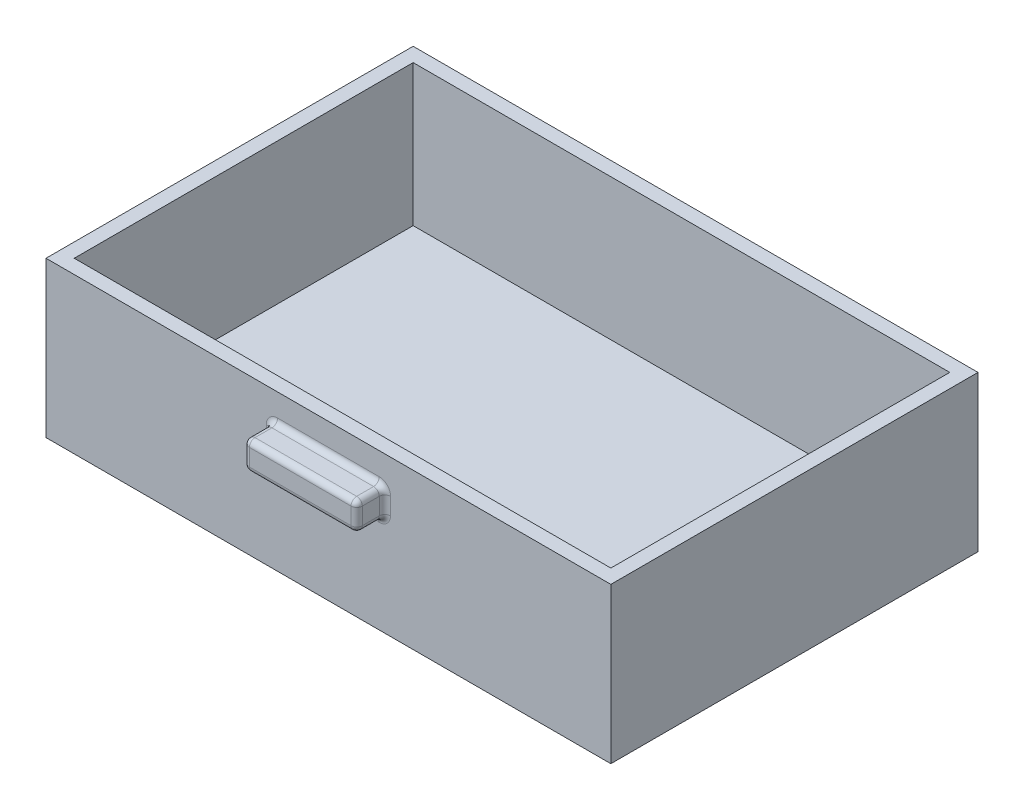
ISO-10303-21;
HEADER;
FILE_DESCRIPTION(('STEP AP214'),'2;1');
FILE_NAME('part.step','',(''),(''),'','','');
FILE_SCHEMA(('AUTOMOTIVE_DESIGN { 1 0 10303 214 1 1 1 1 }'));
ENDSEC;
DATA;
#1=APPLICATION_CONTEXT('core data for automotive mechanical design processes');
#2=APPLICATION_PROTOCOL_DEFINITION('international standard','automotive_design',2000,#1);
#3=PRODUCT_CONTEXT('',#1,'mechanical');
#4=PRODUCT('Part','Part','',(#3));
#5=PRODUCT_RELATED_PRODUCT_CATEGORY('part','',(#4));
#6=PRODUCT_DEFINITION_FORMATION('','',#4);
#7=PRODUCT_DEFINITION_CONTEXT('part definition',#1,'design');
#8=PRODUCT_DEFINITION('design','',#6,#7);
#9=PRODUCT_DEFINITION_SHAPE('','',#8);
#10=(LENGTH_UNIT() NAMED_UNIT(*) SI_UNIT(.MILLI.,.METRE.));
#11=(NAMED_UNIT(*) PLANE_ANGLE_UNIT() SI_UNIT($,.RADIAN.));
#12=(NAMED_UNIT(*) SI_UNIT($,.STERADIAN.) SOLID_ANGLE_UNIT());
#13=UNCERTAINTY_MEASURE_WITH_UNIT(LENGTH_MEASURE(1.E-05),#10,'distance_accuracy_value','');
#14=(GEOMETRIC_REPRESENTATION_CONTEXT(3) GLOBAL_UNCERTAINTY_ASSIGNED_CONTEXT((#13)) GLOBAL_UNIT_ASSIGNED_CONTEXT((#10,
#11,#12)) REPRESENTATION_CONTEXT('',''));
#15=CARTESIAN_POINT('',(0.,0.,0.));
#16=DIRECTION('',(0.,0.,1.));
#17=DIRECTION('',(1.,0.,0.));
#18=AXIS2_PLACEMENT_3D('',#15,#16,#17);
#19=CARTESIAN_POINT('',(-127.,6.35,82.55));
#20=DIRECTION('',(0.,0.,-1.));
#21=DIRECTION('',(-1.,0.,0.));
#22=AXIS2_PLACEMENT_3D('',#19,#20,#21);
#23=PLANE('',#22);
#24=DIRECTION('',(1.,0.,0.));
#25=VECTOR('',#24,1.);
#26=CARTESIAN_POINT('',(-127.,0.,82.55));
#27=LINE('',#26,#25);
#28=CARTESIAN_POINT('',(-127.,0.,82.55));
#29=VERTEX_POINT('',#28);
#30=CARTESIAN_POINT('',(127.,0.,82.55));
#31=VERTEX_POINT('',#30);
#32=EDGE_CURVE('E346',#29,#31,#27,.T.);
#33=ORIENTED_EDGE('',*,*,#32,.T.);
#34=DIRECTION('',(0.,-1.,0.));
#35=VECTOR('',#34,1.);
#36=CARTESIAN_POINT('',(127.,6.35,82.55));
#37=LINE('',#36,#35);
#38=CARTESIAN_POINT('',(127.,69.85,82.55));
#39=VERTEX_POINT('',#38);
#40=EDGE_CURVE('E349',#39,#31,#37,.T.);
#41=ORIENTED_EDGE('',*,*,#40,.F.);
#42=DIRECTION('',(1.,0.,0.));
#43=VECTOR('',#42,1.);
#44=CARTESIAN_POINT('',(-127.,69.85,82.55));
#45=LINE('',#44,#43);
#46=CARTESIAN_POINT('',(-127.,69.85,82.55));
#47=VERTEX_POINT('',#46);
#48=EDGE_CURVE('E324',#47,#39,#45,.T.);
#49=ORIENTED_EDGE('',*,*,#48,.F.);
#50=DIRECTION('',(0.,-1.,0.));
#51=VECTOR('',#50,1.);
#52=CARTESIAN_POINT('',(-127.,6.35,82.55));
#53=LINE('',#52,#51);
#54=EDGE_CURVE('E353',#47,#29,#53,.T.);
#55=ORIENTED_EDGE('',*,*,#54,.T.);
#56=EDGE_LOOP('',(#33,#41,#49,#55));
#57=FACE_BOUND('',#56,.T.);
#58=DIRECTION('',(1.,0.,0.));
#59=VECTOR('',#58,1.);
#60=CARTESIAN_POINT('',(22.225,41.91,82.55));
#61=LINE('',#60,#59);
#62=CARTESIAN_POINT('',(22.86,41.91,82.55));
#63=VERTEX_POINT('',#62);
#64=CARTESIAN_POINT('',(22.225,41.91,82.55));
#65=VERTEX_POINT('',#64);
#66=EDGE_CURVE('E409',#63,#65,#61,.F.);
#67=ORIENTED_EDGE('',*,*,#66,.T.);
#68=DIRECTION('',(0.,-1.,0.));
#69=VECTOR('',#68,1.);
#70=CARTESIAN_POINT('',(22.225,53.34,82.55));
#71=LINE('',#70,#69);
#72=CARTESIAN_POINT('',(22.225,53.34,82.55));
#73=VERTEX_POINT('',#72);
#74=EDGE_CURVE('E238',#73,#65,#71,.T.);
#75=ORIENTED_EDGE('',*,*,#74,.F.);
#76=DIRECTION('',(1.,0.,0.));
#77=VECTOR('',#76,1.);
#78=CARTESIAN_POINT('',(-22.225,53.34,82.55));
#79=LINE('',#78,#77);
#80=CARTESIAN_POINT('',(-22.225,53.34,82.55));
#81=VERTEX_POINT('',#80);
#82=EDGE_CURVE('E242',#81,#73,#79,.T.);
#83=ORIENTED_EDGE('',*,*,#82,.F.);
#84=DIRECTION('',(0.,-1.,0.));
#85=VECTOR('',#84,1.);
#86=CARTESIAN_POINT('',(-22.225,53.34,82.55));
#87=LINE('',#86,#85);
#88=CARTESIAN_POINT('',(-22.225,41.91,82.55));
#89=VERTEX_POINT('',#88);
#90=EDGE_CURVE('E227',#81,#89,#87,.T.);
#91=ORIENTED_EDGE('',*,*,#90,.T.);
#92=DIRECTION('',(1.,0.,0.));
#93=VECTOR('',#92,1.);
#94=CARTESIAN_POINT('',(-25.4,41.91,82.55));
#95=LINE('',#94,#93);
#96=CARTESIAN_POINT('',(-22.86,41.91,82.55));
#97=VERTEX_POINT('',#96);
#98=EDGE_CURVE('E402',#89,#97,#95,.F.);
#99=ORIENTED_EDGE('',*,*,#98,.T.);
#100=CARTESIAN_POINT('',(-22.86,46.99,82.55));
#101=DIRECTION('',(0.,0.,-1.));
#102=DIRECTION('',(-1.,0.,0.));
#103=AXIS2_PLACEMENT_3D('',#100,#101,#102);
#104=CIRCLE('',#103,5.08);
#105=CARTESIAN_POINT('',(-27.94,46.99,82.55));
#106=VERTEX_POINT('',#105);
#107=EDGE_CURVE('E398',#106,#97,#104,.F.);
#108=ORIENTED_EDGE('',*,*,#107,.F.);
#109=DIRECTION('',(0.,-1.,0.));
#110=VECTOR('',#109,1.);
#111=CARTESIAN_POINT('',(-27.94,57.15,82.55));
#112=LINE('',#111,#110);
#113=CARTESIAN_POINT('',(-27.94,54.61,82.55));
#114=VERTEX_POINT('',#113);
#115=EDGE_CURVE('E392',#106,#114,#112,.F.);
#116=ORIENTED_EDGE('',*,*,#115,.T.);
#117=CARTESIAN_POINT('',(-22.86,54.61,82.55));
#118=DIRECTION('',(0.,0.,-1.));
#119=DIRECTION('',(-1.,0.,0.));
#120=AXIS2_PLACEMENT_3D('',#117,#118,#119);
#121=CIRCLE('',#120,5.08);
#122=CARTESIAN_POINT('',(-22.86,59.69,82.55));
#123=VERTEX_POINT('',#122);
#124=EDGE_CURVE('E388',#123,#114,#121,.F.);
#125=ORIENTED_EDGE('',*,*,#124,.F.);
#126=DIRECTION('',(-1.,0.,0.));
#127=VECTOR('',#126,1.);
#128=CARTESIAN_POINT('',(25.4,59.69,82.55));
#129=LINE('',#128,#127);
#130=CARTESIAN_POINT('',(22.86,59.69,82.55));
#131=VERTEX_POINT('',#130);
#132=EDGE_CURVE('E385',#123,#131,#129,.F.);
#133=ORIENTED_EDGE('',*,*,#132,.T.);
#134=CARTESIAN_POINT('',(22.86,54.61,82.55));
#135=DIRECTION('',(0.,0.,-1.));
#136=DIRECTION('',(-1.,0.,0.));
#137=AXIS2_PLACEMENT_3D('',#134,#135,#136);
#138=CIRCLE('',#137,5.08);
#139=CARTESIAN_POINT('',(27.94,54.61,82.55));
#140=VERTEX_POINT('',#139);
#141=EDGE_CURVE('E381',#140,#131,#138,.F.);
#142=ORIENTED_EDGE('',*,*,#141,.F.);
#143=DIRECTION('',(0.,1.,0.));
#144=VECTOR('',#143,1.);
#145=CARTESIAN_POINT('',(27.94,44.45,82.55));
#146=LINE('',#145,#144);
#147=CARTESIAN_POINT('',(27.94,46.99,82.55));
#148=VERTEX_POINT('',#147);
#149=EDGE_CURVE('E395',#140,#148,#146,.F.);
#150=ORIENTED_EDGE('',*,*,#149,.T.);
#151=CARTESIAN_POINT('',(22.86,46.99,82.55));
#152=DIRECTION('',(0.,0.,-1.));
#153=DIRECTION('',(-1.,0.,0.));
#154=AXIS2_PLACEMENT_3D('',#151,#152,#153);
#155=CIRCLE('',#154,5.08);
#156=EDGE_CURVE('E405',#63,#148,#155,.F.);
#157=ORIENTED_EDGE('',*,*,#156,.F.);
#158=EDGE_LOOP('',(#67,#75,#83,#91,#99,#108,#116,#125,#133,#142,#150,#157));
#159=FACE_BOUND('',#158,.T.);
#160=ADVANCED_FACE('F47',(#57,#159),#23,.F.);
#161=CARTESIAN_POINT('',(127.,6.35,82.55));
#162=DIRECTION('',(-1.,0.,0.));
#163=DIRECTION('',(0.,0.,1.));
#164=AXIS2_PLACEMENT_3D('',#161,#162,#163);
#165=PLANE('',#164);
#166=DIRECTION('',(0.,0.,-1.));
#167=VECTOR('',#166,1.);
#168=CARTESIAN_POINT('',(127.,0.,82.55));
#169=LINE('',#168,#167);
#170=CARTESIAN_POINT('',(127.,0.,-82.55));
#171=VERTEX_POINT('',#170);
#172=EDGE_CURVE('E336',#31,#171,#169,.T.);
#173=ORIENTED_EDGE('',*,*,#172,.T.);
#174=DIRECTION('',(0.,-1.,0.));
#175=VECTOR('',#174,1.);
#176=CARTESIAN_POINT('',(127.,6.35,-82.55));
#177=LINE('',#176,#175);
#178=CARTESIAN_POINT('',(127.,69.85,-82.55));
#179=VERTEX_POINT('',#178);
#180=EDGE_CURVE('E361',#179,#171,#177,.T.);
#181=ORIENTED_EDGE('',*,*,#180,.F.);
#182=DIRECTION('',(0.,0.,-1.));
#183=VECTOR('',#182,1.);
#184=CARTESIAN_POINT('',(127.,69.85,82.55));
#185=LINE('',#184,#183);
#186=EDGE_CURVE('E328',#39,#179,#185,.T.);
#187=ORIENTED_EDGE('',*,*,#186,.F.);
#188=ORIENTED_EDGE('',*,*,#40,.T.);
#189=EDGE_LOOP('',(#173,#181,#187,#188));
#190=FACE_BOUND('',#189,.T.);
#191=ADVANCED_FACE('F663',(#190),#165,.F.);
#192=CARTESIAN_POINT('',(-127.,6.35,-82.55));
#193=DIRECTION('',(0.,0.,1.));
#194=DIRECTION('',(1.,0.,0.));
#195=AXIS2_PLACEMENT_3D('',#192,#193,#194);
#196=PLANE('',#195);
#197=DIRECTION('',(-1.,0.,0.));
#198=VECTOR('',#197,1.);
#199=CARTESIAN_POINT('',(-127.,0.,-82.55));
#200=LINE('',#199,#198);
#201=CARTESIAN_POINT('',(-127.,0.,-82.55));
#202=VERTEX_POINT('',#201);
#203=EDGE_CURVE('E340',#171,#202,#200,.T.);
#204=ORIENTED_EDGE('',*,*,#203,.T.);
#205=DIRECTION('',(0.,-1.,0.));
#206=VECTOR('',#205,1.);
#207=CARTESIAN_POINT('',(-127.,6.35,-82.55));
#208=LINE('',#207,#206);
#209=CARTESIAN_POINT('',(-127.,69.85,-82.55));
#210=VERTEX_POINT('',#209);
#211=EDGE_CURVE('E357',#210,#202,#208,.T.);
#212=ORIENTED_EDGE('',*,*,#211,.F.);
#213=DIRECTION('',(-1.,0.,0.));
#214=VECTOR('',#213,1.);
#215=CARTESIAN_POINT('',(-127.,69.85,-82.55));
#216=LINE('',#215,#214);
#217=EDGE_CURVE('E332',#179,#210,#216,.T.);
#218=ORIENTED_EDGE('',*,*,#217,.F.);
#219=ORIENTED_EDGE('',*,*,#180,.T.);
#220=EDGE_LOOP('',(#204,#212,#218,#219));
#221=FACE_BOUND('',#220,.T.);
#222=ADVANCED_FACE('F670',(#221),#196,.F.);
#223=CARTESIAN_POINT('',(-127.,6.35,82.55));
#224=DIRECTION('',(1.,0.,0.));
#225=DIRECTION('',(0.,0.,-1.));
#226=AXIS2_PLACEMENT_3D('',#223,#224,#225);
#227=PLANE('',#226);
#228=DIRECTION('',(0.,0.,1.));
#229=VECTOR('',#228,1.);
#230=CARTESIAN_POINT('',(-127.,0.,82.55));
#231=LINE('',#230,#229);
#232=EDGE_CURVE('E343',#202,#29,#231,.T.);
#233=ORIENTED_EDGE('',*,*,#232,.T.);
#234=ORIENTED_EDGE('',*,*,#54,.F.);
#235=DIRECTION('',(0.,0.,1.));
#236=VECTOR('',#235,1.);
#237=CARTESIAN_POINT('',(-127.,69.85,82.55));
#238=LINE('',#237,#236);
#239=EDGE_CURVE('E320',#210,#47,#238,.T.);
#240=ORIENTED_EDGE('',*,*,#239,.F.);
#241=ORIENTED_EDGE('',*,*,#211,.T.);
#242=EDGE_LOOP('',(#233,#234,#240,#241));
#243=FACE_BOUND('',#242,.T.);
#244=ADVANCED_FACE('F677',(#243),#227,.F.);
#245=CARTESIAN_POINT('',(0.,0.,0.));
#246=DIRECTION('',(0.,-1.,0.));
#247=DIRECTION('',(0.,0.,-1.));
#248=AXIS2_PLACEMENT_3D('',#245,#246,#247);
#249=PLANE('',#248);
#250=ORIENTED_EDGE('',*,*,#172,.F.);
#251=ORIENTED_EDGE('',*,*,#32,.F.);
#252=ORIENTED_EDGE('',*,*,#232,.F.);
#253=ORIENTED_EDGE('',*,*,#203,.F.);
#254=EDGE_LOOP('',(#250,#251,#252,#253));
#255=FACE_BOUND('',#254,.T.);
#256=ADVANCED_FACE('F675',(#255),#249,.T.);
#257=CARTESIAN_POINT('',(0.,69.85,0.));
#258=DIRECTION('',(0.,-1.,0.));
#259=DIRECTION('',(0.,0.,-1.));
#260=AXIS2_PLACEMENT_3D('',#257,#258,#259);
#261=PLANE('',#260);
#262=ORIENTED_EDGE('',*,*,#239,.T.);
#263=ORIENTED_EDGE('',*,*,#48,.T.);
#264=ORIENTED_EDGE('',*,*,#186,.T.);
#265=ORIENTED_EDGE('',*,*,#217,.T.);
#266=EDGE_LOOP('',(#262,#263,#264,#265));
#267=FACE_BOUND('',#266,.T.);
#268=DIRECTION('',(1.,0.,0.));
#269=VECTOR('',#268,1.);
#270=CARTESIAN_POINT('',(-120.65,69.85,76.2));
#271=LINE('',#270,#269);
#272=CARTESIAN_POINT('',(-120.65,69.85,76.2));
#273=VERTEX_POINT('',#272);
#274=CARTESIAN_POINT('',(120.65,69.85,76.2));
#275=VERTEX_POINT('',#274);
#276=EDGE_CURVE('E279',#273,#275,#271,.T.);
#277=ORIENTED_EDGE('',*,*,#276,.F.);
#278=DIRECTION('',(0.,0.,1.));
#279=VECTOR('',#278,1.);
#280=CARTESIAN_POINT('',(-120.65,69.85,76.2));
#281=LINE('',#280,#279);
#282=CARTESIAN_POINT('',(-120.65,69.85,-76.2));
#283=VERTEX_POINT('',#282);
#284=EDGE_CURVE('E290',#283,#273,#281,.T.);
#285=ORIENTED_EDGE('',*,*,#284,.F.);
#286=DIRECTION('',(-1.,0.,0.));
#287=VECTOR('',#286,1.);
#288=CARTESIAN_POINT('',(-120.65,69.85,-76.2));
#289=LINE('',#288,#287);
#290=CARTESIAN_POINT('',(120.65,69.85,-76.2));
#291=VERTEX_POINT('',#290);
#292=EDGE_CURVE('E286',#291,#283,#289,.T.);
#293=ORIENTED_EDGE('',*,*,#292,.F.);
#294=DIRECTION('',(0.,0.,-1.));
#295=VECTOR('',#294,1.);
#296=CARTESIAN_POINT('',(120.65,69.85,76.2));
#297=LINE('',#296,#295);
#298=EDGE_CURVE('E282',#275,#291,#297,.T.);
#299=ORIENTED_EDGE('',*,*,#298,.F.);
#300=EDGE_LOOP('',(#277,#285,#293,#299));
#301=FACE_BOUND('',#300,.T.);
#302=ADVANCED_FACE('F953',(#267,#301),#261,.F.);
#303=CARTESIAN_POINT('',(-120.65,69.85,76.2));
#304=DIRECTION('',(0.,0.,-1.));
#305=DIRECTION('',(-1.,0.,0.));
#306=AXIS2_PLACEMENT_3D('',#303,#304,#305);
#307=PLANE('',#306);
#308=DIRECTION('',(1.,0.,0.));
#309=VECTOR('',#308,1.);
#310=CARTESIAN_POINT('',(-120.65,6.35,76.2));
#311=LINE('',#310,#309);
#312=CARTESIAN_POINT('',(-120.65,6.35,76.2));
#313=VERTEX_POINT('',#312);
#314=CARTESIAN_POINT('',(120.65,6.35,76.2));
#315=VERTEX_POINT('',#314);
#316=EDGE_CURVE('E272',#313,#315,#311,.T.);
#317=ORIENTED_EDGE('',*,*,#316,.F.);
#318=DIRECTION('',(0.,-1.,0.));
#319=VECTOR('',#318,1.);
#320=CARTESIAN_POINT('',(-120.65,69.85,76.2));
#321=LINE('',#320,#319);
#322=EDGE_CURVE('E293',#273,#313,#321,.T.);
#323=ORIENTED_EDGE('',*,*,#322,.F.);
#324=ORIENTED_EDGE('',*,*,#276,.T.);
#325=DIRECTION('',(0.,-1.,0.));
#326=VECTOR('',#325,1.);
#327=CARTESIAN_POINT('',(120.65,69.85,76.2));
#328=LINE('',#327,#326);
#329=EDGE_CURVE('E316',#275,#315,#328,.T.);
#330=ORIENTED_EDGE('',*,*,#329,.T.);
#331=EDGE_LOOP('',(#317,#323,#324,#330));
#332=FACE_BOUND('',#331,.T.);
#333=ADVANCED_FACE('F944',(#332),#307,.T.);
#334=CARTESIAN_POINT('',(120.65,69.85,76.2));
#335=DIRECTION('',(-1.,0.,0.));
#336=DIRECTION('',(0.,0.,1.));
#337=AXIS2_PLACEMENT_3D('',#334,#335,#336);
#338=PLANE('',#337);
#339=DIRECTION('',(0.,0.,-1.));
#340=VECTOR('',#339,1.);
#341=CARTESIAN_POINT('',(120.65,6.35,76.2));
#342=LINE('',#341,#340);
#343=CARTESIAN_POINT('',(120.65,6.35,-76.2));
#344=VERTEX_POINT('',#343);
#345=EDGE_CURVE('E297',#315,#344,#342,.T.);
#346=ORIENTED_EDGE('',*,*,#345,.F.);
#347=ORIENTED_EDGE('',*,*,#329,.F.);
#348=ORIENTED_EDGE('',*,*,#298,.T.);
#349=DIRECTION('',(0.,-1.,0.));
#350=VECTOR('',#349,1.);
#351=CARTESIAN_POINT('',(120.65,69.85,-76.2));
#352=LINE('',#351,#350);
#353=EDGE_CURVE('E313',#291,#344,#352,.T.);
#354=ORIENTED_EDGE('',*,*,#353,.T.);
#355=EDGE_LOOP('',(#346,#347,#348,#354));
#356=FACE_BOUND('',#355,.T.);
#357=ADVANCED_FACE('F935',(#356),#338,.T.);
#358=CARTESIAN_POINT('',(-120.65,69.85,-76.2));
#359=DIRECTION('',(0.,0.,1.));
#360=DIRECTION('',(1.,0.,0.));
#361=AXIS2_PLACEMENT_3D('',#358,#359,#360);
#362=PLANE('',#361);
#363=DIRECTION('',(-1.,0.,0.));
#364=VECTOR('',#363,1.);
#365=CARTESIAN_POINT('',(-120.65,6.35,-76.2));
#366=LINE('',#365,#364);
#367=CARTESIAN_POINT('',(-120.65,6.35,-76.2));
#368=VERTEX_POINT('',#367);
#369=EDGE_CURVE('E301',#344,#368,#366,.T.);
#370=ORIENTED_EDGE('',*,*,#369,.F.);
#371=ORIENTED_EDGE('',*,*,#353,.F.);
#372=ORIENTED_EDGE('',*,*,#292,.T.);
#373=DIRECTION('',(0.,-1.,0.));
#374=VECTOR('',#373,1.);
#375=CARTESIAN_POINT('',(-120.65,69.85,-76.2));
#376=LINE('',#375,#374);
#377=EDGE_CURVE('E310',#283,#368,#376,.T.);
#378=ORIENTED_EDGE('',*,*,#377,.T.);
#379=EDGE_LOOP('',(#370,#371,#372,#378));
#380=FACE_BOUND('',#379,.T.);
#381=ADVANCED_FACE('F926',(#380),#362,.T.);
#382=CARTESIAN_POINT('',(-120.65,69.85,76.2));
#383=DIRECTION('',(1.,0.,0.));
#384=DIRECTION('',(0.,0.,-1.));
#385=AXIS2_PLACEMENT_3D('',#382,#383,#384);
#386=PLANE('',#385);
#387=DIRECTION('',(0.,0.,1.));
#388=VECTOR('',#387,1.);
#389=CARTESIAN_POINT('',(-120.65,6.35,76.2));
#390=LINE('',#389,#388);
#391=EDGE_CURVE('E283',#368,#313,#390,.T.);
#392=ORIENTED_EDGE('',*,*,#391,.F.);
#393=ORIENTED_EDGE('',*,*,#377,.F.);
#394=ORIENTED_EDGE('',*,*,#284,.T.);
#395=ORIENTED_EDGE('',*,*,#322,.T.);
#396=EDGE_LOOP('',(#392,#393,#394,#395));
#397=FACE_BOUND('',#396,.T.);
#398=ADVANCED_FACE('F921',(#397),#386,.T.);
#399=CARTESIAN_POINT('',(0.,6.35,0.));
#400=DIRECTION('',(0.,-1.,0.));
#401=DIRECTION('',(0.,0.,-1.));
#402=AXIS2_PLACEMENT_3D('',#399,#400,#401);
#403=PLANE('',#402);
#404=ORIENTED_EDGE('',*,*,#391,.T.);
#405=ORIENTED_EDGE('',*,*,#316,.T.);
#406=ORIENTED_EDGE('',*,*,#345,.T.);
#407=ORIENTED_EDGE('',*,*,#369,.T.);
#408=EDGE_LOOP('',(#404,#405,#406,#407));
#409=FACE_BOUND('',#408,.T.);
#410=ADVANCED_FACE('F909',(#409),#403,.F.);
#411=CARTESIAN_POINT('',(-25.4,57.15,95.25));
#412=DIRECTION('',(1.,0.,0.));
#413=DIRECTION('',(0.,0.,-1.));
#414=AXIS2_PLACEMENT_3D('',#411,#412,#413);
#415=PLANE('',#414);
#416=DIRECTION('',(0.,0.,-1.));
#417=VECTOR('',#416,1.);
#418=CARTESIAN_POINT('',(-25.4,54.61,95.25));
#419=LINE('',#418,#417);
#420=CARTESIAN_POINT('',(-25.4,54.61,92.71));
#421=VERTEX_POINT('',#420);
#422=CARTESIAN_POINT('',(-25.4,54.61,85.09));
#423=VERTEX_POINT('',#422);
#424=EDGE_CURVE('E431',#421,#423,#419,.T.);
#425=ORIENTED_EDGE('',*,*,#424,.T.);
#426=DIRECTION('',(0.,-1.,0.));
#427=VECTOR('',#426,1.);
#428=CARTESIAN_POINT('',(-25.4,44.45,85.09));
#429=LINE('',#428,#427);
#430=CARTESIAN_POINT('',(-25.4,46.99,85.09));
#431=VERTEX_POINT('',#430);
#432=EDGE_CURVE('E434',#423,#431,#429,.T.);
#433=ORIENTED_EDGE('',*,*,#432,.T.);
#434=DIRECTION('',(0.,0.,-1.));
#435=VECTOR('',#434,1.);
#436=CARTESIAN_POINT('',(-25.4,46.99,95.25));
#437=LINE('',#436,#435);
#438=CARTESIAN_POINT('',(-25.4,46.99,92.71));
#439=VERTEX_POINT('',#438);
#440=EDGE_CURVE('E428',#431,#439,#437,.F.);
#441=ORIENTED_EDGE('',*,*,#440,.T.);
#442=DIRECTION('',(0.,-1.,0.));
#443=VECTOR('',#442,1.);
#444=CARTESIAN_POINT('',(-25.4,57.15,92.71));
#445=LINE('',#444,#443);
#446=EDGE_CURVE('E425',#439,#421,#445,.F.);
#447=ORIENTED_EDGE('',*,*,#446,.T.);
#448=EDGE_LOOP('',(#425,#433,#441,#447));
#449=FACE_BOUND('',#448,.T.);
#450=ADVANCED_FACE('F616',(#449),#415,.F.);
#451=CARTESIAN_POINT('',(-25.4,44.45,95.25));
#452=DIRECTION('',(0.,1.,0.));
#453=DIRECTION('',(0.,0.,1.));
#454=AXIS2_PLACEMENT_3D('',#451,#452,#453);
#455=PLANE('',#454);
#456=DIRECTION('',(0.,0.,1.));
#457=VECTOR('',#456,1.);
#458=CARTESIAN_POINT('',(22.225,44.45,82.55));
#459=LINE('',#458,#457);
#460=CARTESIAN_POINT('',(22.225,44.45,85.09));
#461=VERTEX_POINT('',#460);
#462=CARTESIAN_POINT('',(22.225,44.45,90.8261821525913));
#463=VERTEX_POINT('',#462);
#464=EDGE_CURVE('E257',#461,#463,#459,.T.);
#465=ORIENTED_EDGE('',*,*,#464,.F.);
#466=DIRECTION('',(1.,0.,0.));
#467=VECTOR('',#466,1.);
#468=CARTESIAN_POINT('',(25.4,44.45,85.09));
#469=LINE('',#468,#467);
#470=CARTESIAN_POINT('',(22.86,44.45,85.09));
#471=VERTEX_POINT('',#470);
#472=EDGE_CURVE('E377',#461,#471,#469,.T.);
#473=ORIENTED_EDGE('',*,*,#472,.T.);
#474=DIRECTION('',(0.,0.,-1.));
#475=VECTOR('',#474,1.);
#476=CARTESIAN_POINT('',(22.86,44.45,95.25));
#477=LINE('',#476,#475);
#478=CARTESIAN_POINT('',(22.86,44.45,92.71));
#479=VERTEX_POINT('',#478);
#480=EDGE_CURVE('E371',#471,#479,#477,.F.);
#481=ORIENTED_EDGE('',*,*,#480,.T.);
#482=DIRECTION('',(1.,0.,0.));
#483=VECTOR('',#482,1.);
#484=CARTESIAN_POINT('',(-25.4,44.45,92.71));
#485=LINE('',#484,#483);
#486=CARTESIAN_POINT('',(-22.86,44.45,92.71));
#487=VERTEX_POINT('',#486);
#488=EDGE_CURVE('E365',#479,#487,#485,.F.);
#489=ORIENTED_EDGE('',*,*,#488,.T.);
#490=DIRECTION('',(0.,0.,-1.));
#491=VECTOR('',#490,1.);
#492=CARTESIAN_POINT('',(-22.86,44.45,95.25));
#493=LINE('',#492,#491);
#494=CARTESIAN_POINT('',(-22.86,44.45,85.09));
#495=VERTEX_POINT('',#494);
#496=EDGE_CURVE('E368',#487,#495,#493,.T.);
#497=ORIENTED_EDGE('',*,*,#496,.T.);
#498=DIRECTION('',(1.,0.,0.));
#499=VECTOR('',#498,1.);
#500=CARTESIAN_POINT('',(-22.225,44.45,85.09));
#501=LINE('',#500,#499);
#502=CARTESIAN_POINT('',(-22.225,44.45,85.09));
#503=VERTEX_POINT('',#502);
#504=EDGE_CURVE('E374',#495,#503,#501,.T.);
#505=ORIENTED_EDGE('',*,*,#504,.T.);
#506=DIRECTION('',(0.,0.,-1.));
#507=VECTOR('',#506,1.);
#508=CARTESIAN_POINT('',(-22.225,44.45,82.55));
#509=LINE('',#508,#507);
#510=CARTESIAN_POINT('',(-22.225,44.45,90.8261821525913));
#511=VERTEX_POINT('',#510);
#512=EDGE_CURVE('E264',#511,#503,#509,.T.);
#513=ORIENTED_EDGE('',*,*,#512,.F.);
#514=DIRECTION('',(-1.,0.,0.));
#515=VECTOR('',#514,1.);
#516=CARTESIAN_POINT('',(-22.225,44.45,90.8261821525913));
#517=LINE('',#516,#515);
#518=EDGE_CURVE('E253',#463,#511,#517,.T.);
#519=ORIENTED_EDGE('',*,*,#518,.F.);
#520=EDGE_LOOP('',(#465,#473,#481,#489,#497,#505,#513,#519));
#521=FACE_BOUND('',#520,.T.);
#522=ADVANCED_FACE('F564',(#521),#455,.F.);
#523=CARTESIAN_POINT('',(25.4,57.15,95.25));
#524=DIRECTION('',(-1.,0.,0.));
#525=DIRECTION('',(0.,-1.,0.));
#526=AXIS2_PLACEMENT_3D('',#523,#524,#525);
#527=PLANE('',#526);
#528=DIRECTION('',(0.,0.,-1.));
#529=VECTOR('',#528,1.);
#530=CARTESIAN_POINT('',(25.4,46.99,95.25));
#531=LINE('',#530,#529);
#532=CARTESIAN_POINT('',(25.4,46.99,92.71));
#533=VERTEX_POINT('',#532);
#534=CARTESIAN_POINT('',(25.4,46.99,85.09));
#535=VERTEX_POINT('',#534);
#536=EDGE_CURVE('E415',#533,#535,#531,.T.);
#537=ORIENTED_EDGE('',*,*,#536,.T.);
#538=DIRECTION('',(0.,1.,0.));
#539=VECTOR('',#538,1.);
#540=CARTESIAN_POINT('',(25.4,57.15,85.09));
#541=LINE('',#540,#539);
#542=CARTESIAN_POINT('',(25.4,54.61,85.09));
#543=VERTEX_POINT('',#542);
#544=EDGE_CURVE('E421',#535,#543,#541,.T.);
#545=ORIENTED_EDGE('',*,*,#544,.T.);
#546=DIRECTION('',(0.,0.,-1.));
#547=VECTOR('',#546,1.);
#548=CARTESIAN_POINT('',(25.4,54.61,95.25));
#549=LINE('',#548,#547);
#550=CARTESIAN_POINT('',(25.4,54.61,92.71));
#551=VERTEX_POINT('',#550);
#552=EDGE_CURVE('E418',#543,#551,#549,.F.);
#553=ORIENTED_EDGE('',*,*,#552,.T.);
#554=DIRECTION('',(0.,1.,0.));
#555=VECTOR('',#554,1.);
#556=CARTESIAN_POINT('',(25.4,44.45,92.71));
#557=LINE('',#556,#555);
#558=EDGE_CURVE('E412',#551,#533,#557,.F.);
#559=ORIENTED_EDGE('',*,*,#558,.T.);
#560=EDGE_LOOP('',(#537,#545,#553,#559));
#561=FACE_BOUND('',#560,.T.);
#562=ADVANCED_FACE('F645',(#561),#527,.F.);
#563=CARTESIAN_POINT('',(-25.4,57.15,95.25));
#564=DIRECTION('',(0.,-1.,0.));
#565=DIRECTION('',(0.,0.,-1.));
#566=AXIS2_PLACEMENT_3D('',#563,#564,#565);
#567=PLANE('',#566);
#568=DIRECTION('',(-1.,0.,0.));
#569=VECTOR('',#568,1.);
#570=CARTESIAN_POINT('',(25.4,57.15,92.71));
#571=LINE('',#570,#569);
#572=CARTESIAN_POINT('',(-22.86,57.15,92.71));
#573=VERTEX_POINT('',#572);
#574=CARTESIAN_POINT('',(22.86,57.15,92.71));
#575=VERTEX_POINT('',#574);
#576=EDGE_CURVE('E444',#573,#575,#571,.F.);
#577=ORIENTED_EDGE('',*,*,#576,.T.);
#578=DIRECTION('',(0.,0.,-1.));
#579=VECTOR('',#578,1.);
#580=CARTESIAN_POINT('',(22.86,57.15,95.25));
#581=LINE('',#580,#579);
#582=CARTESIAN_POINT('',(22.86,57.15,85.09));
#583=VERTEX_POINT('',#582);
#584=EDGE_CURVE('E447',#575,#583,#581,.T.);
#585=ORIENTED_EDGE('',*,*,#584,.T.);
#586=DIRECTION('',(-1.,0.,0.));
#587=VECTOR('',#586,1.);
#588=CARTESIAN_POINT('',(-25.4,57.15,85.09));
#589=LINE('',#588,#587);
#590=CARTESIAN_POINT('',(-22.86,57.15,85.09));
#591=VERTEX_POINT('',#590);
#592=EDGE_CURVE('E438',#583,#591,#589,.T.);
#593=ORIENTED_EDGE('',*,*,#592,.T.);
#594=DIRECTION('',(0.,0.,-1.));
#595=VECTOR('',#594,1.);
#596=CARTESIAN_POINT('',(-22.86,57.15,95.25));
#597=LINE('',#596,#595);
#598=EDGE_CURVE('E441',#591,#573,#597,.F.);
#599=ORIENTED_EDGE('',*,*,#598,.T.);
#600=EDGE_LOOP('',(#577,#585,#593,#599));
#601=FACE_BOUND('',#600,.T.);
#602=ADVANCED_FACE('F649',(#601),#567,.F.);
#603=CARTESIAN_POINT('',(0.,0.,95.25));
#604=DIRECTION('',(0.,0.,1.));
#605=DIRECTION('',(1.,0.,0.));
#606=AXIS2_PLACEMENT_3D('',#603,#604,#605);
#607=PLANE('',#606);
#608=DIRECTION('',(1.,0.,0.));
#609=VECTOR('',#608,1.);
#610=CARTESIAN_POINT('',(25.4,46.99,95.25));
#611=LINE('',#610,#609);
#612=CARTESIAN_POINT('',(-22.86,46.99,95.25));
#613=VERTEX_POINT('',#612);
#614=CARTESIAN_POINT('',(22.86,46.99,95.25));
#615=VERTEX_POINT('',#614);
#616=EDGE_CURVE('E70',#613,#615,#611,.T.);
#617=ORIENTED_EDGE('',*,*,#616,.T.);
#618=DIRECTION('',(0.,1.,0.));
#619=VECTOR('',#618,1.);
#620=CARTESIAN_POINT('',(22.86,57.15,95.25));
#621=LINE('',#620,#619);
#622=CARTESIAN_POINT('',(22.86,54.61,95.25));
#623=VERTEX_POINT('',#622);
#624=EDGE_CURVE('E65',#615,#623,#621,.T.);
#625=ORIENTED_EDGE('',*,*,#624,.T.);
#626=DIRECTION('',(-1.,0.,0.));
#627=VECTOR('',#626,1.);
#628=CARTESIAN_POINT('',(-25.4,54.61,95.25));
#629=LINE('',#628,#627);
#630=CARTESIAN_POINT('',(-22.86,54.61,95.25));
#631=VERTEX_POINT('',#630);
#632=EDGE_CURVE('E456',#623,#631,#629,.T.);
#633=ORIENTED_EDGE('',*,*,#632,.T.);
#634=DIRECTION('',(0.,-1.,0.));
#635=VECTOR('',#634,1.);
#636=CARTESIAN_POINT('',(-22.86,44.45,95.25));
#637=LINE('',#636,#635);
#638=EDGE_CURVE('E451',#631,#613,#637,.T.);
#639=ORIENTED_EDGE('',*,*,#638,.T.);
#640=EDGE_LOOP('',(#617,#625,#633,#639));
#641=FACE_BOUND('',#640,.T.);
#642=ADVANCED_FACE('F605',(#641),#607,.T.);
#643=CARTESIAN_POINT('',(-22.225,53.34,82.55));
#644=DIRECTION('',(-1.,0.,0.));
#645=DIRECTION('',(0.,0.,1.));
#646=AXIS2_PLACEMENT_3D('',#643,#644,#645);
#647=PLANE('',#646);
#648=ORIENTED_EDGE('',*,*,#512,.T.);
#649=CARTESIAN_POINT('',(-22.225,41.91,85.09));
#650=DIRECTION('',(-1.,0.,0.));
#651=DIRECTION('',(0.,0.,1.));
#652=AXIS2_PLACEMENT_3D('',#649,#650,#651);
#653=CIRCLE('',#652,2.54);
#654=EDGE_CURVE('E11',#503,#89,#653,.T.);
#655=ORIENTED_EDGE('',*,*,#654,.T.);
#656=ORIENTED_EDGE('',*,*,#90,.F.);
#657=DIRECTION('',(0.,0.,-1.));
#658=VECTOR('',#657,1.);
#659=CARTESIAN_POINT('',(-22.225,53.34,82.55));
#660=LINE('',#659,#658);
#661=CARTESIAN_POINT('',(-22.225,53.34,90.8261821525913));
#662=VERTEX_POINT('',#661);
#663=EDGE_CURVE('E232',#662,#81,#660,.T.);
#664=ORIENTED_EDGE('',*,*,#663,.F.);
#665=DIRECTION('',(0.,-1.,0.));
#666=VECTOR('',#665,1.);
#667=CARTESIAN_POINT('',(-22.225,53.34,90.8261821525913));
#668=LINE('',#667,#666);
#669=EDGE_CURVE('E269',#662,#511,#668,.T.);
#670=ORIENTED_EDGE('',*,*,#669,.T.);
#671=EDGE_LOOP('',(#648,#655,#656,#664,#670));
#672=FACE_BOUND('',#671,.T.);
#673=ADVANCED_FACE('F230',(#672),#647,.F.);
#674=CARTESIAN_POINT('',(-22.225,53.34,90.8261821525913));
#675=DIRECTION('',(0.,0.,1.));
#676=DIRECTION('',(1.,0.,0.));
#677=AXIS2_PLACEMENT_3D('',#674,#675,#676);
#678=PLANE('',#677);
#679=ORIENTED_EDGE('',*,*,#518,.T.);
#680=ORIENTED_EDGE('',*,*,#669,.F.);
#681=DIRECTION('',(-1.,0.,0.));
#682=VECTOR('',#681,1.);
#683=CARTESIAN_POINT('',(-22.225,53.34,90.8261821525913));
#684=LINE('',#683,#682);
#685=CARTESIAN_POINT('',(22.225,53.34,90.8261821525913));
#686=VERTEX_POINT('',#685);
#687=EDGE_CURVE('E239',#686,#662,#684,.T.);
#688=ORIENTED_EDGE('',*,*,#687,.F.);
#689=DIRECTION('',(0.,-1.,0.));
#690=VECTOR('',#689,1.);
#691=CARTESIAN_POINT('',(22.225,53.34,90.8261821525913));
#692=LINE('',#691,#690);
#693=EDGE_CURVE('E273',#686,#463,#692,.T.);
#694=ORIENTED_EDGE('',*,*,#693,.T.);
#695=EDGE_LOOP('',(#679,#680,#688,#694));
#696=FACE_BOUND('',#695,.T.);
#697=ADVANCED_FACE('F567',(#696),#678,.F.);
#698=CARTESIAN_POINT('',(22.225,53.34,82.55));
#699=DIRECTION('',(1.,0.,0.));
#700=DIRECTION('',(0.,0.,-1.));
#701=AXIS2_PLACEMENT_3D('',#698,#699,#700);
#702=PLANE('',#701);
#703=ORIENTED_EDGE('',*,*,#74,.T.);
#704=CARTESIAN_POINT('',(22.225,41.91,85.09));
#705=DIRECTION('',(1.,0.,0.));
#706=DIRECTION('',(0.,0.,-1.));
#707=AXIS2_PLACEMENT_3D('',#704,#705,#706);
#708=CIRCLE('',#707,2.54);
#709=EDGE_CURVE('E57',#65,#461,#708,.T.);
#710=ORIENTED_EDGE('',*,*,#709,.T.);
#711=ORIENTED_EDGE('',*,*,#464,.T.);
#712=ORIENTED_EDGE('',*,*,#693,.F.);
#713=DIRECTION('',(0.,0.,1.));
#714=VECTOR('',#713,1.);
#715=CARTESIAN_POINT('',(22.225,53.34,82.55));
#716=LINE('',#715,#714);
#717=EDGE_CURVE('E248',#73,#686,#716,.T.);
#718=ORIENTED_EDGE('',*,*,#717,.F.);
#719=EDGE_LOOP('',(#703,#710,#711,#712,#718));
#720=FACE_BOUND('',#719,.T.);
#721=ADVANCED_FACE('F659',(#720),#702,.F.);
#722=CARTESIAN_POINT('',(0.,53.34,0.));
#723=DIRECTION('',(0.,1.,0.));
#724=DIRECTION('',(0.,0.,1.));
#725=AXIS2_PLACEMENT_3D('',#722,#723,#724);
#726=PLANE('',#725);
#727=ORIENTED_EDGE('',*,*,#663,.T.);
#728=ORIENTED_EDGE('',*,*,#82,.T.);
#729=ORIENTED_EDGE('',*,*,#717,.T.);
#730=ORIENTED_EDGE('',*,*,#687,.T.);
#731=EDGE_LOOP('',(#727,#728,#729,#730));
#732=FACE_BOUND('',#731,.T.);
#733=ADVANCED_FACE('F250',(#732),#726,.F.);
#734=CARTESIAN_POINT('',(-22.86,54.61,92.71));
#735=DIRECTION('',(0.,0.,1.));
#736=DIRECTION('',(1.,0.,0.));
#737=AXIS2_PLACEMENT_3D('',#734,#735,#736);
#738=SPHERICAL_SURFACE('',#737,2.54);
#739=CARTESIAN_POINT('',(-22.86,54.61,92.71));
#740=DIRECTION('',(0.,0.,1.));
#741=DIRECTION('',(1.,0.,0.));
#742=AXIS2_PLACEMENT_3D('',#739,#740,#741);
#743=CIRCLE('',#742,2.54);
#744=EDGE_CURVE('E536',#421,#573,#743,.F.);
#745=ORIENTED_EDGE('',*,*,#744,.F.);
#746=CARTESIAN_POINT('',(-22.86,54.61,92.71));
#747=DIRECTION('',(0.,1.,0.));
#748=DIRECTION('',(0.,0.,1.));
#749=AXIS2_PLACEMENT_3D('',#746,#747,#748);
#750=CIRCLE('',#749,2.54);
#751=EDGE_CURVE('E544',#631,#421,#750,.F.);
#752=ORIENTED_EDGE('',*,*,#751,.F.);
#753=CARTESIAN_POINT('',(-22.86,54.61,92.71));
#754=DIRECTION('',(-1.,0.,0.));
#755=DIRECTION('',(0.,0.,1.));
#756=AXIS2_PLACEMENT_3D('',#753,#754,#755);
#757=CIRCLE('',#756,2.54);
#758=EDGE_CURVE('E540',#573,#631,#757,.F.);
#759=ORIENTED_EDGE('',*,*,#758,.F.);
#760=EDGE_LOOP('',(#745,#752,#759));
#761=FACE_BOUND('',#760,.T.);
#762=ADVANCED_FACE('F652',(#761),#738,.T.);
#763=CARTESIAN_POINT('',(-25.4,41.91,85.09));
#764=DIRECTION('',(-1.,0.,0.));
#765=DIRECTION('',(0.,0.,1.));
#766=AXIS2_PLACEMENT_3D('',#763,#764,#765);
#767=CYLINDRICAL_SURFACE('',#766,2.54);
#768=CARTESIAN_POINT('',(-22.86,41.91,85.09));
#769=DIRECTION('',(1.,0.,0.));
#770=DIRECTION('',(0.,0.,-1.));
#771=AXIS2_PLACEMENT_3D('',#768,#769,#770);
#772=CIRCLE('',#771,2.54);
#773=EDGE_CURVE('E51',#97,#495,#772,.T.);
#774=ORIENTED_EDGE('',*,*,#773,.F.);
#775=ORIENTED_EDGE('',*,*,#98,.F.);
#776=ORIENTED_EDGE('',*,*,#654,.F.);
#777=ORIENTED_EDGE('',*,*,#504,.F.);
#778=EDGE_LOOP('',(#774,#775,#776,#777));
#779=FACE_BOUND('',#778,.T.);
#780=ADVANCED_FACE('F49',(#779),#767,.F.);
#781=CARTESIAN_POINT('',(-22.86,46.99,85.09));
#782=DIRECTION('',(0.,0.,-1.));
#783=DIRECTION('',(-1.,0.,0.));
#784=AXIS2_PLACEMENT_3D('',#781,#782,#783);
#785=TOROIDAL_SURFACE('',#784,5.08,2.54);
#786=ORIENTED_EDGE('',*,*,#107,.T.);
#787=ORIENTED_EDGE('',*,*,#773,.T.);
#788=CARTESIAN_POINT('',(-22.86,46.99,85.09));
#789=DIRECTION('',(0.,0.,-1.));
#790=DIRECTION('',(-1.,0.,0.));
#791=AXIS2_PLACEMENT_3D('',#788,#789,#790);
#792=CIRCLE('',#791,2.54);
#793=EDGE_CURVE('E547',#431,#495,#792,.F.);
#794=ORIENTED_EDGE('',*,*,#793,.F.);
#795=CARTESIAN_POINT('',(-27.94,46.99,85.09));
#796=DIRECTION('',(0.,1.,0.));
#797=DIRECTION('',(0.,0.,1.));
#798=AXIS2_PLACEMENT_3D('',#795,#796,#797);
#799=CIRCLE('',#798,2.54);
#800=EDGE_CURVE('E532',#106,#431,#799,.F.);
#801=ORIENTED_EDGE('',*,*,#800,.F.);
#802=EDGE_LOOP('',(#786,#787,#794,#801));
#803=FACE_BOUND('',#802,.T.);
#804=ADVANCED_FACE('F557',(#803),#785,.F.);
#805=CARTESIAN_POINT('',(-22.86,46.99,95.25));
#806=DIRECTION('',(0.,0.,-1.));
#807=DIRECTION('',(-1.,0.,0.));
#808=AXIS2_PLACEMENT_3D('',#805,#806,#807);
#809=CYLINDRICAL_SURFACE('',#808,2.54);
#810=ORIENTED_EDGE('',*,*,#793,.T.);
#811=ORIENTED_EDGE('',*,*,#496,.F.);
#812=CARTESIAN_POINT('',(-22.86,46.99,92.71));
#813=DIRECTION('',(0.,0.,1.));
#814=DIRECTION('',(1.,0.,0.));
#815=AXIS2_PLACEMENT_3D('',#812,#813,#814);
#816=CIRCLE('',#815,2.54);
#817=EDGE_CURVE('E528',#439,#487,#816,.T.);
#818=ORIENTED_EDGE('',*,*,#817,.F.);
#819=ORIENTED_EDGE('',*,*,#440,.F.);
#820=EDGE_LOOP('',(#810,#811,#818,#819));
#821=FACE_BOUND('',#820,.T.);
#822=ADVANCED_FACE('F614',(#821),#809,.T.);
#823=CARTESIAN_POINT('',(-22.86,0.,92.71));
#824=DIRECTION('',(0.,1.,0.));
#825=DIRECTION('',(0.,0.,1.));
#826=AXIS2_PLACEMENT_3D('',#823,#824,#825);
#827=CYLINDRICAL_SURFACE('',#826,2.54);
#828=ORIENTED_EDGE('',*,*,#751,.T.);
#829=ORIENTED_EDGE('',*,*,#446,.F.);
#830=CARTESIAN_POINT('',(-22.86,46.99,92.71));
#831=DIRECTION('',(0.,-1.,0.));
#832=DIRECTION('',(0.,0.,-1.));
#833=AXIS2_PLACEMENT_3D('',#830,#831,#832);
#834=CIRCLE('',#833,2.54);
#835=EDGE_CURVE('E524',#613,#439,#834,.T.);
#836=ORIENTED_EDGE('',*,*,#835,.F.);
#837=ORIENTED_EDGE('',*,*,#638,.F.);
#838=EDGE_LOOP('',(#828,#829,#836,#837));
#839=FACE_BOUND('',#838,.T.);
#840=ADVANCED_FACE('F610',(#839),#827,.T.);
#841=CARTESIAN_POINT('',(0.,54.61,92.71));
#842=DIRECTION('',(1.,0.,0.));
#843=DIRECTION('',(0.,0.,-1.));
#844=AXIS2_PLACEMENT_3D('',#841,#842,#843);
#845=CYLINDRICAL_SURFACE('',#844,2.54);
#846=ORIENTED_EDGE('',*,*,#758,.T.);
#847=ORIENTED_EDGE('',*,*,#632,.F.);
#848=CARTESIAN_POINT('',(22.86,54.61,92.71));
#849=DIRECTION('',(1.,0.,0.));
#850=DIRECTION('',(0.,0.,-1.));
#851=AXIS2_PLACEMENT_3D('',#848,#849,#850);
#852=CIRCLE('',#851,2.54);
#853=EDGE_CURVE('E520',#575,#623,#852,.T.);
#854=ORIENTED_EDGE('',*,*,#853,.F.);
#855=ORIENTED_EDGE('',*,*,#576,.F.);
#856=EDGE_LOOP('',(#846,#847,#854,#855));
#857=FACE_BOUND('',#856,.T.);
#858=ADVANCED_FACE('F603',(#857),#845,.T.);
#859=CARTESIAN_POINT('',(-22.86,54.61,95.25));
#860=DIRECTION('',(0.,0.,-1.));
#861=DIRECTION('',(-1.,0.,0.));
#862=AXIS2_PLACEMENT_3D('',#859,#860,#861);
#863=CYLINDRICAL_SURFACE('',#862,2.54);
#864=ORIENTED_EDGE('',*,*,#744,.T.);
#865=ORIENTED_EDGE('',*,*,#598,.F.);
#866=CARTESIAN_POINT('',(-22.86,54.61,85.09));
#867=DIRECTION('',(0.,0.,-1.));
#868=DIRECTION('',(-1.,0.,0.));
#869=AXIS2_PLACEMENT_3D('',#866,#867,#868);
#870=CIRCLE('',#869,2.54);
#871=EDGE_CURVE('E516',#423,#591,#870,.T.);
#872=ORIENTED_EDGE('',*,*,#871,.F.);
#873=ORIENTED_EDGE('',*,*,#424,.F.);
#874=EDGE_LOOP('',(#864,#865,#872,#873));
#875=FACE_BOUND('',#874,.T.);
#876=ADVANCED_FACE('F626',(#875),#863,.T.);
#877=CARTESIAN_POINT('',(-27.94,57.15,85.09));
#878=DIRECTION('',(0.,1.,0.));
#879=DIRECTION('',(0.,0.,1.));
#880=AXIS2_PLACEMENT_3D('',#877,#878,#879);
#881=CYLINDRICAL_SURFACE('',#880,2.54);
#882=ORIENTED_EDGE('',*,*,#800,.T.);
#883=ORIENTED_EDGE('',*,*,#432,.F.);
#884=CARTESIAN_POINT('',(-27.94,54.61,85.09));
#885=DIRECTION('',(0.,-1.,0.));
#886=DIRECTION('',(0.,0.,-1.));
#887=AXIS2_PLACEMENT_3D('',#884,#885,#886);
#888=CIRCLE('',#887,2.54);
#889=EDGE_CURVE('E512',#114,#423,#888,.T.);
#890=ORIENTED_EDGE('',*,*,#889,.F.);
#891=ORIENTED_EDGE('',*,*,#115,.F.);
#892=EDGE_LOOP('',(#882,#883,#890,#891));
#893=FACE_BOUND('',#892,.T.);
#894=ADVANCED_FACE('F622',(#893),#881,.F.);
#895=CARTESIAN_POINT('',(-22.86,46.99,92.71));
#896=DIRECTION('',(-1.,0.,0.));
#897=DIRECTION('',(0.,0.,1.));
#898=AXIS2_PLACEMENT_3D('',#895,#896,#897);
#899=SPHERICAL_SURFACE('',#898,2.54);
#900=ORIENTED_EDGE('',*,*,#835,.T.);
#901=ORIENTED_EDGE('',*,*,#817,.T.);
#902=CARTESIAN_POINT('',(-22.86,46.99,92.71));
#903=DIRECTION('',(-1.,0.,0.));
#904=DIRECTION('',(0.,0.,1.));
#905=AXIS2_PLACEMENT_3D('',#902,#903,#904);
#906=CIRCLE('',#905,2.54);
#907=EDGE_CURVE('E508',#613,#487,#906,.F.);
#908=ORIENTED_EDGE('',*,*,#907,.F.);
#909=EDGE_LOOP('',(#900,#901,#908));
#910=FACE_BOUND('',#909,.T.);
#911=ADVANCED_FACE('F613',(#910),#899,.T.);
#912=CARTESIAN_POINT('',(22.86,54.61,92.71));
#913=DIRECTION('',(0.,0.,1.));
#914=DIRECTION('',(1.,0.,0.));
#915=AXIS2_PLACEMENT_3D('',#912,#913,#914);
#916=SPHERICAL_SURFACE('',#915,2.54);
#917=CARTESIAN_POINT('',(22.86,54.61,92.71));
#918=DIRECTION('',(0.,0.,1.));
#919=DIRECTION('',(1.,0.,0.));
#920=AXIS2_PLACEMENT_3D('',#917,#918,#919);
#921=CIRCLE('',#920,2.54);
#922=EDGE_CURVE('E500',#575,#551,#921,.F.);
#923=ORIENTED_EDGE('',*,*,#922,.F.);
#924=ORIENTED_EDGE('',*,*,#853,.T.);
#925=CARTESIAN_POINT('',(22.86,54.61,92.71));
#926=DIRECTION('',(0.,1.,0.));
#927=DIRECTION('',(0.,0.,1.));
#928=AXIS2_PLACEMENT_3D('',#925,#926,#927);
#929=CIRCLE('',#928,2.54);
#930=EDGE_CURVE('E504',#551,#623,#929,.F.);
#931=ORIENTED_EDGE('',*,*,#930,.F.);
#932=EDGE_LOOP('',(#923,#924,#931));
#933=FACE_BOUND('',#932,.T.);
#934=ADVANCED_FACE('F598',(#933),#916,.T.);
#935=CARTESIAN_POINT('',(-22.86,54.61,85.09));
#936=DIRECTION('',(0.,0.,-1.));
#937=DIRECTION('',(-1.,0.,0.));
#938=AXIS2_PLACEMENT_3D('',#935,#936,#937);
#939=TOROIDAL_SURFACE('',#938,5.08,2.54);
#940=ORIENTED_EDGE('',*,*,#889,.T.);
#941=ORIENTED_EDGE('',*,*,#871,.T.);
#942=CARTESIAN_POINT('',(-22.86,59.69,85.09));
#943=DIRECTION('',(1.,0.,0.));
#944=DIRECTION('',(0.,0.,-1.));
#945=AXIS2_PLACEMENT_3D('',#942,#943,#944);
#946=CIRCLE('',#945,2.54);
#947=EDGE_CURVE('E496',#123,#591,#946,.F.);
#948=ORIENTED_EDGE('',*,*,#947,.F.);
#949=ORIENTED_EDGE('',*,*,#124,.T.);
#950=EDGE_LOOP('',(#940,#941,#948,#949));
#951=FACE_BOUND('',#950,.T.);
#952=ADVANCED_FACE('F629',(#951),#939,.F.);
#953=CARTESIAN_POINT('',(0.,46.99,92.71));
#954=DIRECTION('',(-1.,0.,0.));
#955=DIRECTION('',(0.,0.,1.));
#956=AXIS2_PLACEMENT_3D('',#953,#954,#955);
#957=CYLINDRICAL_SURFACE('',#956,2.54);
#958=ORIENTED_EDGE('',*,*,#907,.T.);
#959=ORIENTED_EDGE('',*,*,#488,.F.);
#960=CARTESIAN_POINT('',(22.86,46.99,92.71));
#961=DIRECTION('',(1.,0.,0.));
#962=DIRECTION('',(0.,0.,-1.));
#963=AXIS2_PLACEMENT_3D('',#960,#961,#962);
#964=CIRCLE('',#963,2.54);
#965=EDGE_CURVE('E492',#615,#479,#964,.T.);
#966=ORIENTED_EDGE('',*,*,#965,.F.);
#967=ORIENTED_EDGE('',*,*,#616,.F.);
#968=EDGE_LOOP('',(#958,#959,#966,#967));
#969=FACE_BOUND('',#968,.T.);
#970=ADVANCED_FACE('F587',(#969),#957,.T.);
#971=CARTESIAN_POINT('',(22.86,0.,92.71));
#972=DIRECTION('',(0.,-1.,0.));
#973=DIRECTION('',(1.,0.,0.));
#974=AXIS2_PLACEMENT_3D('',#971,#972,#973);
#975=CYLINDRICAL_SURFACE('',#974,2.54);
#976=ORIENTED_EDGE('',*,*,#930,.T.);
#977=ORIENTED_EDGE('',*,*,#624,.F.);
#978=CARTESIAN_POINT('',(22.86,46.99,92.71));
#979=DIRECTION('',(0.,-1.,0.));
#980=DIRECTION('',(0.,0.,-1.));
#981=AXIS2_PLACEMENT_3D('',#978,#979,#980);
#982=CIRCLE('',#981,2.54);
#983=EDGE_CURVE('E488',#533,#615,#982,.T.);
#984=ORIENTED_EDGE('',*,*,#983,.F.);
#985=ORIENTED_EDGE('',*,*,#558,.F.);
#986=EDGE_LOOP('',(#976,#977,#984,#985));
#987=FACE_BOUND('',#986,.T.);
#988=ADVANCED_FACE('F594',(#987),#975,.T.);
#989=CARTESIAN_POINT('',(22.86,54.61,95.25));
#990=DIRECTION('',(0.,0.,-1.));
#991=DIRECTION('',(-1.,0.,0.));
#992=AXIS2_PLACEMENT_3D('',#989,#990,#991);
#993=CYLINDRICAL_SURFACE('',#992,2.54);
#994=ORIENTED_EDGE('',*,*,#922,.T.);
#995=ORIENTED_EDGE('',*,*,#552,.F.);
#996=CARTESIAN_POINT('',(22.86,54.61,85.09));
#997=DIRECTION('',(0.,0.,-1.));
#998=DIRECTION('',(-1.,0.,0.));
#999=AXIS2_PLACEMENT_3D('',#996,#997,#998);
#1000=CIRCLE('',#999,2.54);
#1001=EDGE_CURVE('E484',#583,#543,#1000,.T.);
#1002=ORIENTED_EDGE('',*,*,#1001,.F.);
#1003=ORIENTED_EDGE('',*,*,#584,.F.);
#1004=EDGE_LOOP('',(#994,#995,#1002,#1003));
#1005=FACE_BOUND('',#1004,.T.);
#1006=ADVANCED_FACE('F647',(#1005),#993,.T.);
#1007=CARTESIAN_POINT('',(-25.4,59.69,85.09));
#1008=DIRECTION('',(1.,0.,0.));
#1009=DIRECTION('',(0.,0.,-1.));
#1010=AXIS2_PLACEMENT_3D('',#1007,#1008,#1009);
#1011=CYLINDRICAL_SURFACE('',#1010,2.54);
#1012=ORIENTED_EDGE('',*,*,#947,.T.);
#1013=ORIENTED_EDGE('',*,*,#592,.F.);
#1014=CARTESIAN_POINT('',(22.86,59.69,85.09));
#1015=DIRECTION('',(-1.,0.,0.));
#1016=DIRECTION('',(0.,0.,1.));
#1017=AXIS2_PLACEMENT_3D('',#1014,#1015,#1016);
#1018=CIRCLE('',#1017,2.54);
#1019=EDGE_CURVE('E481',#131,#583,#1018,.T.);
#1020=ORIENTED_EDGE('',*,*,#1019,.F.);
#1021=ORIENTED_EDGE('',*,*,#132,.F.);
#1022=EDGE_LOOP('',(#1012,#1013,#1020,#1021));
#1023=FACE_BOUND('',#1022,.T.);
#1024=ADVANCED_FACE('F635',(#1023),#1011,.F.);
#1025=CARTESIAN_POINT('',(22.86,46.99,92.71));
#1026=DIRECTION('',(0.,0.,1.));
#1027=DIRECTION('',(1.,0.,0.));
#1028=AXIS2_PLACEMENT_3D('',#1025,#1026,#1027);
#1029=SPHERICAL_SURFACE('',#1028,2.54);
#1030=ORIENTED_EDGE('',*,*,#983,.T.);
#1031=ORIENTED_EDGE('',*,*,#965,.T.);
#1032=CARTESIAN_POINT('',(22.86,46.99,92.71));
#1033=DIRECTION('',(0.,0.,1.));
#1034=DIRECTION('',(1.,0.,0.));
#1035=AXIS2_PLACEMENT_3D('',#1032,#1033,#1034);
#1036=CIRCLE('',#1035,2.54);
#1037=EDGE_CURVE('E477',#533,#479,#1036,.F.);
#1038=ORIENTED_EDGE('',*,*,#1037,.F.);
#1039=EDGE_LOOP('',(#1030,#1031,#1038));
#1040=FACE_BOUND('',#1039,.T.);
#1041=ADVANCED_FACE('F590',(#1040),#1029,.T.);
#1042=CARTESIAN_POINT('',(22.86,54.61,85.09));
#1043=DIRECTION('',(0.,0.,-1.));
#1044=DIRECTION('',(-1.,0.,0.));
#1045=AXIS2_PLACEMENT_3D('',#1042,#1043,#1044);
#1046=TOROIDAL_SURFACE('',#1045,5.08,2.54);
#1047=ORIENTED_EDGE('',*,*,#1019,.T.);
#1048=ORIENTED_EDGE('',*,*,#1001,.T.);
#1049=CARTESIAN_POINT('',(27.94,54.61,85.09));
#1050=DIRECTION('',(0.,-1.,0.));
#1051=DIRECTION('',(0.,0.,-1.));
#1052=AXIS2_PLACEMENT_3D('',#1049,#1050,#1051);
#1053=CIRCLE('',#1052,2.54);
#1054=EDGE_CURVE('E474',#140,#543,#1053,.F.);
#1055=ORIENTED_EDGE('',*,*,#1054,.F.);
#1056=ORIENTED_EDGE('',*,*,#141,.T.);
#1057=EDGE_LOOP('',(#1047,#1048,#1055,#1056));
#1058=FACE_BOUND('',#1057,.T.);
#1059=ADVANCED_FACE('F638',(#1058),#1046,.F.);
#1060=CARTESIAN_POINT('',(22.86,46.99,95.25));
#1061=DIRECTION('',(0.,0.,-1.));
#1062=DIRECTION('',(-1.,0.,0.));
#1063=AXIS2_PLACEMENT_3D('',#1060,#1061,#1062);
#1064=CYLINDRICAL_SURFACE('',#1063,2.54);
#1065=ORIENTED_EDGE('',*,*,#1037,.T.);
#1066=ORIENTED_EDGE('',*,*,#480,.F.);
#1067=CARTESIAN_POINT('',(22.86,46.99,85.09));
#1068=DIRECTION('',(0.,0.,-1.));
#1069=DIRECTION('',(-1.,0.,0.));
#1070=AXIS2_PLACEMENT_3D('',#1067,#1068,#1069);
#1071=CIRCLE('',#1070,2.54);
#1072=EDGE_CURVE('E470',#535,#471,#1071,.T.);
#1073=ORIENTED_EDGE('',*,*,#1072,.F.);
#1074=ORIENTED_EDGE('',*,*,#536,.F.);
#1075=EDGE_LOOP('',(#1065,#1066,#1073,#1074));
#1076=FACE_BOUND('',#1075,.T.);
#1077=ADVANCED_FACE('F582',(#1076),#1064,.T.);
#1078=CARTESIAN_POINT('',(27.94,57.15,85.09));
#1079=DIRECTION('',(0.,-1.,0.));
#1080=DIRECTION('',(1.,0.,0.));
#1081=AXIS2_PLACEMENT_3D('',#1078,#1079,#1080);
#1082=CYLINDRICAL_SURFACE('',#1081,2.54);
#1083=ORIENTED_EDGE('',*,*,#1054,.T.);
#1084=ORIENTED_EDGE('',*,*,#544,.F.);
#1085=CARTESIAN_POINT('',(27.94,46.99,85.09));
#1086=DIRECTION('',(0.,1.,0.));
#1087=DIRECTION('',(0.,0.,1.));
#1088=AXIS2_PLACEMENT_3D('',#1085,#1086,#1087);
#1089=CIRCLE('',#1088,2.54);
#1090=EDGE_CURVE('E466',#148,#535,#1089,.T.);
#1091=ORIENTED_EDGE('',*,*,#1090,.F.);
#1092=ORIENTED_EDGE('',*,*,#149,.F.);
#1093=EDGE_LOOP('',(#1083,#1084,#1091,#1092));
#1094=FACE_BOUND('',#1093,.T.);
#1095=ADVANCED_FACE('F643',(#1094),#1082,.F.);
#1096=CARTESIAN_POINT('',(22.86,46.99,85.09));
#1097=DIRECTION('',(0.,0.,-1.));
#1098=DIRECTION('',(-1.,0.,0.));
#1099=AXIS2_PLACEMENT_3D('',#1096,#1097,#1098);
#1100=TOROIDAL_SURFACE('',#1099,5.08,2.54);
#1101=ORIENTED_EDGE('',*,*,#1090,.T.);
#1102=ORIENTED_EDGE('',*,*,#1072,.T.);
#1103=CARTESIAN_POINT('',(22.86,41.91,85.09));
#1104=DIRECTION('',(-1.,0.,0.));
#1105=DIRECTION('',(0.,0.,1.));
#1106=AXIS2_PLACEMENT_3D('',#1103,#1104,#1105);
#1107=CIRCLE('',#1106,2.54);
#1108=EDGE_CURVE('E463',#63,#471,#1107,.F.);
#1109=ORIENTED_EDGE('',*,*,#1108,.F.);
#1110=ORIENTED_EDGE('',*,*,#156,.T.);
#1111=EDGE_LOOP('',(#1101,#1102,#1109,#1110));
#1112=FACE_BOUND('',#1111,.T.);
#1113=ADVANCED_FACE('F578',(#1112),#1100,.F.);
#1114=CARTESIAN_POINT('',(-25.4,41.91,85.09));
#1115=DIRECTION('',(-1.,0.,0.));
#1116=DIRECTION('',(0.,0.,1.));
#1117=AXIS2_PLACEMENT_3D('',#1114,#1115,#1116);
#1118=CYLINDRICAL_SURFACE('',#1117,2.54);
#1119=ORIENTED_EDGE('',*,*,#709,.F.);
#1120=ORIENTED_EDGE('',*,*,#66,.F.);
#1121=ORIENTED_EDGE('',*,*,#1108,.T.);
#1122=ORIENTED_EDGE('',*,*,#472,.F.);
#1123=EDGE_LOOP('',(#1119,#1120,#1121,#1122));
#1124=FACE_BOUND('',#1123,.T.);
#1125=ADVANCED_FACE('F572',(#1124),#1118,.F.);
#1126=CLOSED_SHELL('',(#160,#191,#222,#244,#256,#302,#333,#357,#381,#398,#410,#450,#522,#562,
#602,#642,#673,#697,#721,#733,#762,#780,#804,#822,#840,#858,#876,#894,#911,#934,#952,#970,#988,
#1006,#1024,#1041,#1059,#1077,#1095,#1113,#1125));
#1127=MANIFOLD_SOLID_BREP('B2',#1126);
#1128=ADVANCED_BREP_SHAPE_REPRESENTATION('',(#18,#1127),#14);
#1129=SHAPE_DEFINITION_REPRESENTATION(#9,#1128);
ENDSEC;
END-ISO-10303-21;
